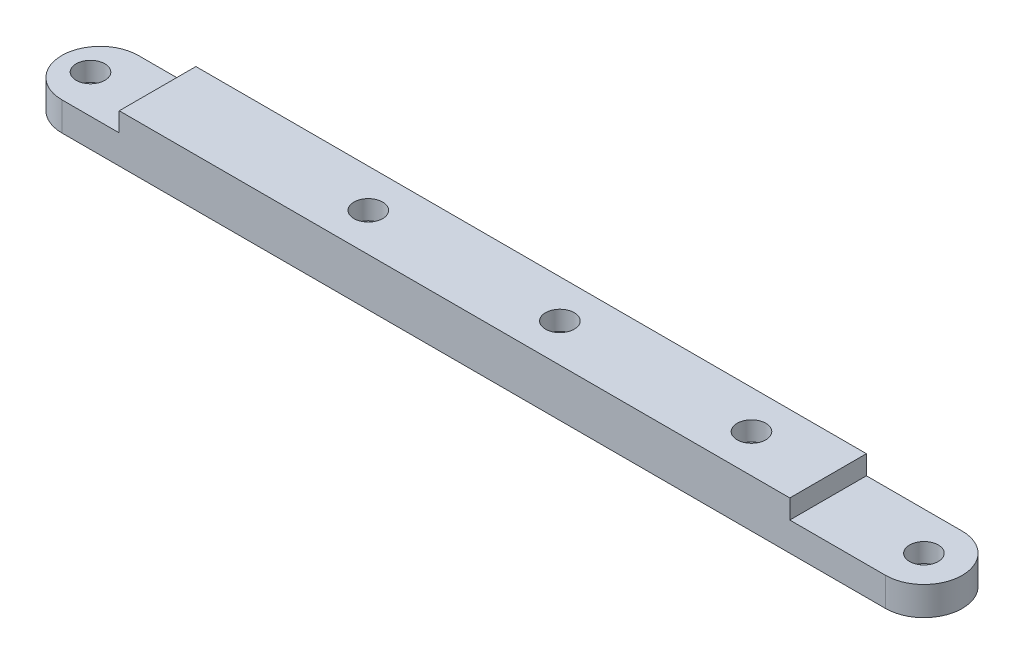
ISO-10303-21;
HEADER;
FILE_DESCRIPTION(('STEP AP214'),'2;1');
FILE_NAME('part.step','',(''),(''),'','','');
FILE_SCHEMA(('AUTOMOTIVE_DESIGN { 1 0 10303 214 1 1 1 1 }'));
ENDSEC;
DATA;
#1=APPLICATION_CONTEXT('core data for automotive mechanical design processes');
#2=APPLICATION_PROTOCOL_DEFINITION('international standard','automotive_design',2000,#1);
#3=PRODUCT_CONTEXT('',#1,'mechanical');
#4=PRODUCT('Part','Part','',(#3));
#5=PRODUCT_RELATED_PRODUCT_CATEGORY('part','',(#4));
#6=PRODUCT_DEFINITION_FORMATION('','',#4);
#7=PRODUCT_DEFINITION_CONTEXT('part definition',#1,'design');
#8=PRODUCT_DEFINITION('design','',#6,#7);
#9=PRODUCT_DEFINITION_SHAPE('','',#8);
#10=(LENGTH_UNIT() NAMED_UNIT(*) SI_UNIT(.MILLI.,.METRE.));
#11=(NAMED_UNIT(*) PLANE_ANGLE_UNIT() SI_UNIT($,.RADIAN.));
#12=(NAMED_UNIT(*) SI_UNIT($,.STERADIAN.) SOLID_ANGLE_UNIT());
#13=UNCERTAINTY_MEASURE_WITH_UNIT(LENGTH_MEASURE(1.E-05),#10,'distance_accuracy_value','');
#14=(GEOMETRIC_REPRESENTATION_CONTEXT(3) GLOBAL_UNCERTAINTY_ASSIGNED_CONTEXT((#13)) GLOBAL_UNIT_ASSIGNED_CONTEXT((#10,
#11,#12)) REPRESENTATION_CONTEXT('',''));
#15=CARTESIAN_POINT('',(0.,0.,0.));
#16=DIRECTION('',(0.,0.,1.));
#17=DIRECTION('',(1.,0.,0.));
#18=AXIS2_PLACEMENT_3D('',#15,#16,#17);
#19=CARTESIAN_POINT('',(-25.,3.,4.));
#20=DIRECTION('',(0.,0.,-1.));
#21=DIRECTION('',(-1.,0.,0.));
#22=AXIS2_PLACEMENT_3D('',#19,#20,#21);
#23=PLANE('',#22);
#24=DIRECTION('',(1.,0.,0.));
#25=VECTOR('',#24,1.);
#26=CARTESIAN_POINT('',(-25.,3.,4.));
#27=LINE('',#26,#25);
#28=CARTESIAN_POINT('',(-21.,3.,4.));
#29=VERTEX_POINT('',#28);
#30=CARTESIAN_POINT('',(-15.,3.,4.));
#31=VERTEX_POINT('',#30);
#32=EDGE_CURVE('E101',#29,#31,#27,.T.);
#33=ORIENTED_EDGE('',*,*,#32,.F.);
#34=DIRECTION('',(0.,-1.,0.));
#35=VECTOR('',#34,1.);
#36=CARTESIAN_POINT('',(-21.,3.,4.));
#37=LINE('',#36,#35);
#38=CARTESIAN_POINT('',(-21.,0.,4.));
#39=VERTEX_POINT('',#38);
#40=EDGE_CURVE('E11',#29,#39,#37,.T.);
#41=ORIENTED_EDGE('',*,*,#40,.T.);
#42=DIRECTION('',(1.,0.,0.));
#43=VECTOR('',#42,1.);
#44=CARTESIAN_POINT('',(-25.,0.,4.));
#45=LINE('',#44,#43);
#46=CARTESIAN_POINT('',(65.,0.,4.));
#47=VERTEX_POINT('',#46);
#48=EDGE_CURVE('E177',#39,#47,#45,.T.);
#49=ORIENTED_EDGE('',*,*,#48,.T.);
#50=DIRECTION('',(0.,-1.,0.));
#51=VECTOR('',#50,1.);
#52=CARTESIAN_POINT('',(65.,3.,4.));
#53=LINE('',#52,#51);
#54=CARTESIAN_POINT('',(65.,3.,4.));
#55=VERTEX_POINT('',#54);
#56=EDGE_CURVE('E183',#55,#47,#53,.T.);
#57=ORIENTED_EDGE('',*,*,#56,.F.);
#58=DIRECTION('',(1.,0.,0.));
#59=VECTOR('',#58,1.);
#60=CARTESIAN_POINT('',(-25.,3.,4.));
#61=LINE('',#60,#59);
#62=CARTESIAN_POINT('',(55.,3.,4.));
#63=VERTEX_POINT('',#62);
#64=EDGE_CURVE('E225',#63,#55,#61,.T.);
#65=ORIENTED_EDGE('',*,*,#64,.F.);
#66=DIRECTION('',(0.,-1.,0.));
#67=VECTOR('',#66,1.);
#68=CARTESIAN_POINT('',(55.,5.,4.));
#69=LINE('',#68,#67);
#70=CARTESIAN_POINT('',(55.,5.,4.));
#71=VERTEX_POINT('',#70);
#72=EDGE_CURVE('E172',#71,#63,#69,.T.);
#73=ORIENTED_EDGE('',*,*,#72,.F.);
#74=DIRECTION('',(1.,0.,0.));
#75=VECTOR('',#74,1.);
#76=CARTESIAN_POINT('',(-25.,5.,4.));
#77=LINE('',#76,#75);
#78=CARTESIAN_POINT('',(-15.,5.,4.));
#79=VERTEX_POINT('',#78);
#80=EDGE_CURVE('E121',#79,#71,#77,.T.);
#81=ORIENTED_EDGE('',*,*,#80,.F.);
#82=DIRECTION('',(0.,1.,0.));
#83=VECTOR('',#82,1.);
#84=CARTESIAN_POINT('',(-15.,3.,4.));
#85=LINE('',#84,#83);
#86=EDGE_CURVE('E113',#31,#79,#85,.T.);
#87=ORIENTED_EDGE('',*,*,#86,.F.);
#88=EDGE_LOOP('',(#33,#41,#49,#57,#65,#73,#81,#87));
#89=FACE_BOUND('',#88,.T.);
#90=ADVANCED_FACE('F35',(#89),#23,.F.);
#91=CARTESIAN_POINT('',(65.,3.,0.));
#92=DIRECTION('',(0.,-1.,0.));
#93=DIRECTION('',(0.,0.,-1.));
#94=AXIS2_PLACEMENT_3D('',#91,#92,#93);
#95=CYLINDRICAL_SURFACE('',#94,4.);
#96=CARTESIAN_POINT('',(65.,0.,0.));
#97=DIRECTION('',(0.,1.,0.));
#98=DIRECTION('',(0.,0.,1.));
#99=AXIS2_PLACEMENT_3D('',#96,#97,#98);
#100=CIRCLE('',#99,4.);
#101=CARTESIAN_POINT('',(65.,0.,-4.));
#102=VERTEX_POINT('',#101);
#103=EDGE_CURVE('E230',#47,#102,#100,.T.);
#104=ORIENTED_EDGE('',*,*,#103,.T.);
#105=DIRECTION('',(0.,-1.,0.));
#106=VECTOR('',#105,1.);
#107=CARTESIAN_POINT('',(65.,3.,-4.));
#108=LINE('',#107,#106);
#109=CARTESIAN_POINT('',(65.,3.,-4.));
#110=VERTEX_POINT('',#109);
#111=EDGE_CURVE('E221',#110,#102,#108,.T.);
#112=ORIENTED_EDGE('',*,*,#111,.F.);
#113=CARTESIAN_POINT('',(65.,3.,0.));
#114=DIRECTION('',(0.,1.,0.));
#115=DIRECTION('',(0.,0.,1.));
#116=AXIS2_PLACEMENT_3D('',#113,#114,#115);
#117=CIRCLE('',#116,4.);
#118=EDGE_CURVE('E223',#55,#110,#117,.T.);
#119=ORIENTED_EDGE('',*,*,#118,.F.);
#120=ORIENTED_EDGE('',*,*,#56,.T.);
#121=EDGE_LOOP('',(#104,#112,#119,#120));
#122=FACE_BOUND('',#121,.T.);
#123=ADVANCED_FACE('F237',(#122),#95,.T.);
#124=CARTESIAN_POINT('',(65.,3.,-4.));
#125=DIRECTION('',(0.,0.,1.));
#126=DIRECTION('',(1.,0.,0.));
#127=AXIS2_PLACEMENT_3D('',#124,#125,#126);
#128=PLANE('',#127);
#129=DIRECTION('',(-1.,0.,0.));
#130=VECTOR('',#129,1.);
#131=CARTESIAN_POINT('',(65.,0.,-4.));
#132=LINE('',#131,#130);
#133=CARTESIAN_POINT('',(-21.,0.,-3.99999999999999));
#134=VERTEX_POINT('',#133);
#135=EDGE_CURVE('E195',#102,#134,#132,.T.);
#136=ORIENTED_EDGE('',*,*,#135,.T.);
#137=DIRECTION('',(0.,-1.,0.));
#138=VECTOR('',#137,1.);
#139=CARTESIAN_POINT('',(-21.,3.,-3.99999999999999));
#140=LINE('',#139,#138);
#141=CARTESIAN_POINT('',(-21.,3.,-3.99999999999999));
#142=VERTEX_POINT('',#141);
#143=EDGE_CURVE('E185',#134,#142,#140,.F.);
#144=ORIENTED_EDGE('',*,*,#143,.T.);
#145=DIRECTION('',(-1.,0.,0.));
#146=VECTOR('',#145,1.);
#147=CARTESIAN_POINT('',(-25.,3.,-3.99999999999999));
#148=LINE('',#147,#146);
#149=CARTESIAN_POINT('',(-15.,3.,-3.99999999999999));
#150=VERTEX_POINT('',#149);
#151=EDGE_CURVE('E117',#150,#142,#148,.T.);
#152=ORIENTED_EDGE('',*,*,#151,.F.);
#153=DIRECTION('',(0.,1.,0.));
#154=VECTOR('',#153,1.);
#155=CARTESIAN_POINT('',(-15.,3.,-3.99999999999999));
#156=LINE('',#155,#154);
#157=CARTESIAN_POINT('',(-15.,5.,-3.99999999999999));
#158=VERTEX_POINT('',#157);
#159=EDGE_CURVE('E116',#150,#158,#156,.T.);
#160=ORIENTED_EDGE('',*,*,#159,.T.);
#161=DIRECTION('',(-1.,0.,0.));
#162=VECTOR('',#161,1.);
#163=CARTESIAN_POINT('',(-25.,5.,-3.99999999999999));
#164=LINE('',#163,#162);
#165=CARTESIAN_POINT('',(55.,5.,-3.99999999999999));
#166=VERTEX_POINT('',#165);
#167=EDGE_CURVE('E155',#166,#158,#164,.T.);
#168=ORIENTED_EDGE('',*,*,#167,.F.);
#169=DIRECTION('',(0.,-1.,0.));
#170=VECTOR('',#169,1.);
#171=CARTESIAN_POINT('',(55.,5.,-3.99999999999999));
#172=LINE('',#171,#170);
#173=CARTESIAN_POINT('',(55.,3.,-3.99999999999999));
#174=VERTEX_POINT('',#173);
#175=EDGE_CURVE('E158',#166,#174,#172,.T.);
#176=ORIENTED_EDGE('',*,*,#175,.T.);
#177=DIRECTION('',(-1.,0.,0.));
#178=VECTOR('',#177,1.);
#179=CARTESIAN_POINT('',(65.,3.,-4.));
#180=LINE('',#179,#178);
#181=EDGE_CURVE('E167',#110,#174,#180,.T.);
#182=ORIENTED_EDGE('',*,*,#181,.F.);
#183=ORIENTED_EDGE('',*,*,#111,.T.);
#184=EDGE_LOOP('',(#136,#144,#152,#160,#168,#176,#182,#183));
#185=FACE_BOUND('',#184,.T.);
#186=ADVANCED_FACE('F192',(#185),#128,.F.);
#187=CARTESIAN_POINT('',(65.,3.,0.));
#188=DIRECTION('',(0.,1.,0.));
#189=DIRECTION('',(0.,0.,1.));
#190=AXIS2_PLACEMENT_3D('',#187,#188,#189);
#191=PLANE('',#190);
#192=CARTESIAN_POINT('',(65.,3.,0.));
#193=DIRECTION('',(0.,1.,0.));
#194=DIRECTION('',(0.,0.,1.));
#195=AXIS2_PLACEMENT_3D('',#192,#193,#194);
#196=CIRCLE('',#195,1.5);
#197=CARTESIAN_POINT('',(65.,3.,1.5));
#198=VERTEX_POINT('',#197);
#199=EDGE_CURVE('E143',#198,#198,#196,.T.);
#200=ORIENTED_EDGE('',*,*,#199,.F.);
#201=EDGE_LOOP('',(#200));
#202=FACE_BOUND('',#201,.T.);
#203=DIRECTION('',(0.,0.,-1.));
#204=VECTOR('',#203,1.);
#205=CARTESIAN_POINT('',(55.,3.,-3.99999999999999));
#206=LINE('',#205,#204);
#207=EDGE_CURVE('E149',#63,#174,#206,.T.);
#208=ORIENTED_EDGE('',*,*,#207,.F.);
#209=ORIENTED_EDGE('',*,*,#64,.T.);
#210=ORIENTED_EDGE('',*,*,#118,.T.);
#211=ORIENTED_EDGE('',*,*,#181,.T.);
#212=EDGE_LOOP('',(#208,#209,#210,#211));
#213=FACE_BOUND('',#212,.T.);
#214=ADVANCED_FACE('F260',(#202,#213),#191,.T.);
#215=CARTESIAN_POINT('',(65.,0.,0.));
#216=DIRECTION('',(0.,1.,0.));
#217=DIRECTION('',(0.,0.,1.));
#218=AXIS2_PLACEMENT_3D('',#215,#216,#217);
#219=PLANE('',#218);
#220=CARTESIAN_POINT('',(-21.,0.,0.));
#221=DIRECTION('',(0.,1.,0.));
#222=DIRECTION('',(0.,0.,1.));
#223=AXIS2_PLACEMENT_3D('',#220,#221,#222);
#224=CIRCLE('',#223,4.);
#225=CARTESIAN_POINT('',(-25.,0.,0.));
#226=VERTEX_POINT('',#225);
#227=EDGE_CURVE('E180',#39,#226,#224,.F.);
#228=ORIENTED_EDGE('',*,*,#227,.T.);
#229=CARTESIAN_POINT('',(-21.,0.,0.));
#230=DIRECTION('',(0.,1.,0.));
#231=DIRECTION('',(0.,0.,1.));
#232=AXIS2_PLACEMENT_3D('',#229,#230,#231);
#233=CIRCLE('',#232,4.);
#234=EDGE_CURVE('E182',#226,#134,#233,.F.);
#235=ORIENTED_EDGE('',*,*,#234,.T.);
#236=ORIENTED_EDGE('',*,*,#135,.F.);
#237=ORIENTED_EDGE('',*,*,#103,.F.);
#238=ORIENTED_EDGE('',*,*,#48,.F.);
#239=EDGE_LOOP('',(#228,#235,#236,#237,#238));
#240=FACE_BOUND('',#239,.T.);
#241=ADVANCED_FACE('F241',(#240),#219,.F.);
#242=CARTESIAN_POINT('',(55.,5.,-3.99999999999999));
#243=DIRECTION('',(-1.,0.,0.));
#244=DIRECTION('',(0.,0.,1.));
#245=AXIS2_PLACEMENT_3D('',#242,#243,#244);
#246=PLANE('',#245);
#247=ORIENTED_EDGE('',*,*,#207,.T.);
#248=ORIENTED_EDGE('',*,*,#175,.F.);
#249=DIRECTION('',(0.,0.,-1.));
#250=VECTOR('',#249,1.);
#251=CARTESIAN_POINT('',(55.,5.,-3.99999999999999));
#252=LINE('',#251,#250);
#253=EDGE_CURVE('E153',#71,#166,#252,.T.);
#254=ORIENTED_EDGE('',*,*,#253,.F.);
#255=ORIENTED_EDGE('',*,*,#72,.T.);
#256=EDGE_LOOP('',(#247,#248,#254,#255));
#257=FACE_BOUND('',#256,.T.);
#258=ADVANCED_FACE('F218',(#257),#246,.F.);
#259=CARTESIAN_POINT('',(0.,5.,0.));
#260=DIRECTION('',(0.,1.,0.));
#261=DIRECTION('',(0.,0.,1.));
#262=AXIS2_PLACEMENT_3D('',#259,#260,#261);
#263=PLANE('',#262);
#264=DIRECTION('',(0.,0.,-1.));
#265=VECTOR('',#264,1.);
#266=CARTESIAN_POINT('',(-15.,5.,-3.99999999999999));
#267=LINE('',#266,#265);
#268=EDGE_CURVE('E109',#79,#158,#267,.T.);
#269=ORIENTED_EDGE('',*,*,#268,.F.);
#270=ORIENTED_EDGE('',*,*,#80,.T.);
#271=ORIENTED_EDGE('',*,*,#253,.T.);
#272=ORIENTED_EDGE('',*,*,#167,.T.);
#273=EDGE_LOOP('',(#269,#270,#271,#272));
#274=FACE_BOUND('',#273,.T.);
#275=CARTESIAN_POINT('',(7.00000000000001,5.,2.82787954059404E-13));
#276=DIRECTION('',(0.,1.,0.));
#277=DIRECTION('',(0.,0.,1.));
#278=AXIS2_PLACEMENT_3D('',#275,#276,#277);
#279=CIRCLE('',#278,1.5);
#280=CARTESIAN_POINT('',(7.00000000000001,5.,1.50000000000029));
#281=VERTEX_POINT('',#280);
#282=EDGE_CURVE('E123',#281,#281,#279,.T.);
#283=ORIENTED_EDGE('',*,*,#282,.F.);
#284=EDGE_LOOP('',(#283));
#285=FACE_BOUND('',#284,.T.);
#286=CARTESIAN_POINT('',(27.,5.,1.43128700505679E-13));
#287=DIRECTION('',(0.,1.,0.));
#288=DIRECTION('',(0.,0.,1.));
#289=AXIS2_PLACEMENT_3D('',#286,#287,#288);
#290=CIRCLE('',#289,1.5);
#291=CARTESIAN_POINT('',(27.,5.,1.50000000000014));
#292=VERTEX_POINT('',#291);
#293=EDGE_CURVE('E131',#292,#292,#290,.T.);
#294=ORIENTED_EDGE('',*,*,#293,.F.);
#295=EDGE_LOOP('',(#294));
#296=FACE_BOUND('',#295,.T.);
#297=CARTESIAN_POINT('',(47.,5.,0.));
#298=DIRECTION('',(0.,1.,0.));
#299=DIRECTION('',(0.,0.,1.));
#300=AXIS2_PLACEMENT_3D('',#297,#298,#299);
#301=CIRCLE('',#300,1.5);
#302=CARTESIAN_POINT('',(47.,5.,1.50000000000001));
#303=VERTEX_POINT('',#302);
#304=EDGE_CURVE('E137',#303,#303,#301,.T.);
#305=ORIENTED_EDGE('',*,*,#304,.F.);
#306=EDGE_LOOP('',(#305));
#307=FACE_BOUND('',#306,.T.);
#308=ADVANCED_FACE('F213',(#274,#285,#296,#307),#263,.T.);
#309=CARTESIAN_POINT('',(65.,1.,0.));
#310=DIRECTION('',(0.,1.,0.));
#311=DIRECTION('',(0.,0.,1.));
#312=AXIS2_PLACEMENT_3D('',#309,#310,#311);
#313=CYLINDRICAL_SURFACE('',#312,1.5);
#314=CARTESIAN_POINT('',(65.,1.,0.));
#315=DIRECTION('',(0.,1.,0.));
#316=DIRECTION('',(0.,0.,1.));
#317=AXIS2_PLACEMENT_3D('',#314,#315,#316);
#318=CIRCLE('',#317,1.5);
#319=CARTESIAN_POINT('',(65.,1.,1.5));
#320=VERTEX_POINT('',#319);
#321=EDGE_CURVE('E146',#320,#320,#318,.T.);
#322=ORIENTED_EDGE('',*,*,#321,.F.);
#323=EDGE_LOOP('',(#322));
#324=FACE_BOUND('',#323,.T.);
#325=ORIENTED_EDGE('',*,*,#199,.T.);
#326=EDGE_LOOP('',(#325));
#327=FACE_BOUND('',#326,.T.);
#328=ADVANCED_FACE('F270',(#324,#327),#313,.F.);
#329=CARTESIAN_POINT('',(65.,1.,0.));
#330=DIRECTION('',(0.,1.,0.));
#331=DIRECTION('',(0.,0.,1.));
#332=AXIS2_PLACEMENT_3D('',#329,#330,#331);
#333=PLANE('',#332);
#334=ORIENTED_EDGE('',*,*,#321,.T.);
#335=EDGE_LOOP('',(#334));
#336=FACE_BOUND('',#335,.T.);
#337=ADVANCED_FACE('F273',(#336),#333,.T.);
#338=CARTESIAN_POINT('',(47.,3.,0.));
#339=DIRECTION('',(0.,1.,0.));
#340=DIRECTION('',(0.,0.,1.));
#341=AXIS2_PLACEMENT_3D('',#338,#339,#340);
#342=CYLINDRICAL_SURFACE('',#341,1.5);
#343=CARTESIAN_POINT('',(47.,3.,0.));
#344=DIRECTION('',(0.,1.,0.));
#345=DIRECTION('',(0.,0.,1.));
#346=AXIS2_PLACEMENT_3D('',#343,#344,#345);
#347=CIRCLE('',#346,1.5);
#348=CARTESIAN_POINT('',(47.,3.,1.50000000000001));
#349=VERTEX_POINT('',#348);
#350=EDGE_CURVE('E140',#349,#349,#347,.T.);
#351=ORIENTED_EDGE('',*,*,#350,.F.);
#352=EDGE_LOOP('',(#351));
#353=FACE_BOUND('',#352,.T.);
#354=ORIENTED_EDGE('',*,*,#304,.T.);
#355=EDGE_LOOP('',(#354));
#356=FACE_BOUND('',#355,.T.);
#357=ADVANCED_FACE('F277',(#353,#356),#342,.F.);
#358=CARTESIAN_POINT('',(47.,3.,0.));
#359=DIRECTION('',(0.,1.,0.));
#360=DIRECTION('',(0.,0.,1.));
#361=AXIS2_PLACEMENT_3D('',#358,#359,#360);
#362=PLANE('',#361);
#363=ORIENTED_EDGE('',*,*,#350,.T.);
#364=EDGE_LOOP('',(#363));
#365=FACE_BOUND('',#364,.T.);
#366=ADVANCED_FACE('F281',(#365),#362,.T.);
#367=CARTESIAN_POINT('',(27.,3.,1.43128700505679E-13));
#368=DIRECTION('',(0.,1.,0.));
#369=DIRECTION('',(0.,0.,1.));
#370=AXIS2_PLACEMENT_3D('',#367,#368,#369);
#371=CYLINDRICAL_SURFACE('',#370,1.5);
#372=CARTESIAN_POINT('',(27.,3.,1.43128700505679E-13));
#373=DIRECTION('',(0.,1.,0.));
#374=DIRECTION('',(0.,0.,1.));
#375=AXIS2_PLACEMENT_3D('',#372,#373,#374);
#376=CIRCLE('',#375,1.5);
#377=CARTESIAN_POINT('',(27.,3.,1.50000000000014));
#378=VERTEX_POINT('',#377);
#379=EDGE_CURVE('E134',#378,#378,#376,.T.);
#380=ORIENTED_EDGE('',*,*,#379,.F.);
#381=EDGE_LOOP('',(#380));
#382=FACE_BOUND('',#381,.T.);
#383=ORIENTED_EDGE('',*,*,#293,.T.);
#384=EDGE_LOOP('',(#383));
#385=FACE_BOUND('',#384,.T.);
#386=ADVANCED_FACE('F285',(#382,#385),#371,.F.);
#387=CARTESIAN_POINT('',(27.,3.,1.43128700505679E-13));
#388=DIRECTION('',(0.,1.,0.));
#389=DIRECTION('',(0.,0.,1.));
#390=AXIS2_PLACEMENT_3D('',#387,#388,#389);
#391=PLANE('',#390);
#392=ORIENTED_EDGE('',*,*,#379,.T.);
#393=EDGE_LOOP('',(#392));
#394=FACE_BOUND('',#393,.T.);
#395=ADVANCED_FACE('F289',(#394),#391,.T.);
#396=CARTESIAN_POINT('',(7.00000000000001,3.,2.82787954059404E-13));
#397=DIRECTION('',(0.,1.,0.));
#398=DIRECTION('',(0.,0.,1.));
#399=AXIS2_PLACEMENT_3D('',#396,#397,#398);
#400=CYLINDRICAL_SURFACE('',#399,1.5);
#401=CARTESIAN_POINT('',(7.00000000000001,3.,2.82787954059404E-13));
#402=DIRECTION('',(0.,1.,0.));
#403=DIRECTION('',(0.,0.,1.));
#404=AXIS2_PLACEMENT_3D('',#401,#402,#403);
#405=CIRCLE('',#404,1.5);
#406=CARTESIAN_POINT('',(7.00000000000001,3.,1.50000000000029));
#407=VERTEX_POINT('',#406);
#408=EDGE_CURVE('E128',#407,#407,#405,.T.);
#409=ORIENTED_EDGE('',*,*,#408,.F.);
#410=EDGE_LOOP('',(#409));
#411=FACE_BOUND('',#410,.T.);
#412=ORIENTED_EDGE('',*,*,#282,.T.);
#413=EDGE_LOOP('',(#412));
#414=FACE_BOUND('',#413,.T.);
#415=ADVANCED_FACE('F293',(#411,#414),#400,.F.);
#416=CARTESIAN_POINT('',(7.00000000000001,3.,2.82787954059404E-13));
#417=DIRECTION('',(0.,1.,0.));
#418=DIRECTION('',(0.,0.,1.));
#419=AXIS2_PLACEMENT_3D('',#416,#417,#418);
#420=PLANE('',#419);
#421=ORIENTED_EDGE('',*,*,#408,.T.);
#422=EDGE_LOOP('',(#421));
#423=FACE_BOUND('',#422,.T.);
#424=ADVANCED_FACE('F297',(#423),#420,.T.);
#425=CARTESIAN_POINT('',(-15.,3.,-3.99999999999999));
#426=DIRECTION('',(1.,0.,0.));
#427=DIRECTION('',(0.,0.,-1.));
#428=AXIS2_PLACEMENT_3D('',#425,#426,#427);
#429=PLANE('',#428);
#430=ORIENTED_EDGE('',*,*,#268,.T.);
#431=ORIENTED_EDGE('',*,*,#159,.F.);
#432=DIRECTION('',(0.,0.,-1.));
#433=VECTOR('',#432,1.);
#434=CARTESIAN_POINT('',(-15.,3.,-3.99999999999999));
#435=LINE('',#434,#433);
#436=EDGE_CURVE('E104',#31,#150,#435,.T.);
#437=ORIENTED_EDGE('',*,*,#436,.F.);
#438=ORIENTED_EDGE('',*,*,#86,.T.);
#439=EDGE_LOOP('',(#430,#431,#437,#438));
#440=FACE_BOUND('',#439,.T.);
#441=ADVANCED_FACE('F112',(#440),#429,.F.);
#442=CARTESIAN_POINT('',(0.,3.,0.));
#443=DIRECTION('',(0.,1.,0.));
#444=DIRECTION('',(0.,0.,1.));
#445=AXIS2_PLACEMENT_3D('',#442,#443,#444);
#446=PLANE('',#445);
#447=CARTESIAN_POINT('',(-22.,3.,0.));
#448=DIRECTION('',(0.,1.,0.));
#449=DIRECTION('',(0.,0.,1.));
#450=AXIS2_PLACEMENT_3D('',#447,#448,#449);
#451=CIRCLE('',#450,1.5);
#452=CARTESIAN_POINT('',(-22.,3.,1.5));
#453=VERTEX_POINT('',#452);
#454=EDGE_CURVE('E203',#453,#453,#451,.T.);
#455=ORIENTED_EDGE('',*,*,#454,.F.);
#456=EDGE_LOOP('',(#455));
#457=FACE_BOUND('',#456,.T.);
#458=ORIENTED_EDGE('',*,*,#151,.T.);
#459=CARTESIAN_POINT('',(-21.,3.,0.));
#460=DIRECTION('',(0.,1.,0.));
#461=DIRECTION('',(0.,0.,1.));
#462=AXIS2_PLACEMENT_3D('',#459,#460,#461);
#463=CIRCLE('',#462,4.);
#464=CARTESIAN_POINT('',(-25.,3.,0.));
#465=VERTEX_POINT('',#464);
#466=EDGE_CURVE('E44',#142,#465,#463,.T.);
#467=ORIENTED_EDGE('',*,*,#466,.T.);
#468=CARTESIAN_POINT('',(-21.,3.,0.));
#469=DIRECTION('',(0.,1.,0.));
#470=DIRECTION('',(0.,0.,1.));
#471=AXIS2_PLACEMENT_3D('',#468,#469,#470);
#472=CIRCLE('',#471,4.);
#473=EDGE_CURVE('E51',#465,#29,#472,.T.);
#474=ORIENTED_EDGE('',*,*,#473,.T.);
#475=ORIENTED_EDGE('',*,*,#32,.T.);
#476=ORIENTED_EDGE('',*,*,#436,.T.);
#477=EDGE_LOOP('',(#458,#467,#474,#475,#476));
#478=FACE_BOUND('',#477,.T.);
#479=ADVANCED_FACE('F103',(#457,#478),#446,.T.);
#480=CARTESIAN_POINT('',(-22.,1.,0.));
#481=DIRECTION('',(0.,1.,0.));
#482=DIRECTION('',(0.,0.,1.));
#483=AXIS2_PLACEMENT_3D('',#480,#481,#482);
#484=CYLINDRICAL_SURFACE('',#483,1.5);
#485=CARTESIAN_POINT('',(-22.,1.,0.));
#486=DIRECTION('',(0.,1.,0.));
#487=DIRECTION('',(0.,0.,1.));
#488=AXIS2_PLACEMENT_3D('',#485,#486,#487);
#489=CIRCLE('',#488,1.5);
#490=CARTESIAN_POINT('',(-22.,1.,1.5));
#491=VERTEX_POINT('',#490);
#492=EDGE_CURVE('E205',#491,#491,#489,.T.);
#493=ORIENTED_EDGE('',*,*,#492,.F.);
#494=EDGE_LOOP('',(#493));
#495=FACE_BOUND('',#494,.T.);
#496=ORIENTED_EDGE('',*,*,#454,.T.);
#497=EDGE_LOOP('',(#496));
#498=FACE_BOUND('',#497,.T.);
#499=ADVANCED_FACE('F248',(#495,#498),#484,.F.);
#500=CARTESIAN_POINT('',(-22.,1.,0.));
#501=DIRECTION('',(0.,1.,0.));
#502=DIRECTION('',(0.,0.,1.));
#503=AXIS2_PLACEMENT_3D('',#500,#501,#502);
#504=PLANE('',#503);
#505=ORIENTED_EDGE('',*,*,#492,.T.);
#506=EDGE_LOOP('',(#505));
#507=FACE_BOUND('',#506,.T.);
#508=ADVANCED_FACE('F243',(#507),#504,.T.);
#509=CARTESIAN_POINT('',(-21.,3.,0.));
#510=DIRECTION('',(0.,-1.,0.));
#511=DIRECTION('',(0.,0.,-1.));
#512=AXIS2_PLACEMENT_3D('',#509,#510,#511);
#513=CYLINDRICAL_SURFACE('',#512,4.);
#514=ORIENTED_EDGE('',*,*,#40,.F.);
#515=ORIENTED_EDGE('',*,*,#473,.F.);
#516=DIRECTION('',(0.,-1.,0.));
#517=VECTOR('',#516,1.);
#518=CARTESIAN_POINT('',(-25.,3.,0.));
#519=LINE('',#518,#517);
#520=EDGE_CURVE('E39',#226,#465,#519,.F.);
#521=ORIENTED_EDGE('',*,*,#520,.F.);
#522=ORIENTED_EDGE('',*,*,#227,.F.);
#523=EDGE_LOOP('',(#514,#515,#521,#522));
#524=FACE_BOUND('',#523,.T.);
#525=ADVANCED_FACE('F37',(#524),#513,.T.);
#526=CARTESIAN_POINT('',(-21.,3.,0.));
#527=DIRECTION('',(0.,-1.,0.));
#528=DIRECTION('',(0.,0.,-1.));
#529=AXIS2_PLACEMENT_3D('',#526,#527,#528);
#530=CYLINDRICAL_SURFACE('',#529,4.);
#531=ORIENTED_EDGE('',*,*,#466,.F.);
#532=ORIENTED_EDGE('',*,*,#143,.F.);
#533=ORIENTED_EDGE('',*,*,#234,.F.);
#534=ORIENTED_EDGE('',*,*,#520,.T.);
#535=EDGE_LOOP('',(#531,#532,#533,#534));
#536=FACE_BOUND('',#535,.T.);
#537=ADVANCED_FACE('F198',(#536),#530,.T.);
#538=CLOSED_SHELL('',(#90,#123,#186,#214,#241,#258,#308,#328,#337,#357,#366,#386,#395,#415,#424,
#441,#479,#499,#508,#525,#537));
#539=MANIFOLD_SOLID_BREP('B2',#538);
#540=ADVANCED_BREP_SHAPE_REPRESENTATION('',(#18,#539),#14);
#541=SHAPE_DEFINITION_REPRESENTATION(#9,#540);
ENDSEC;
END-ISO-10303-21;
